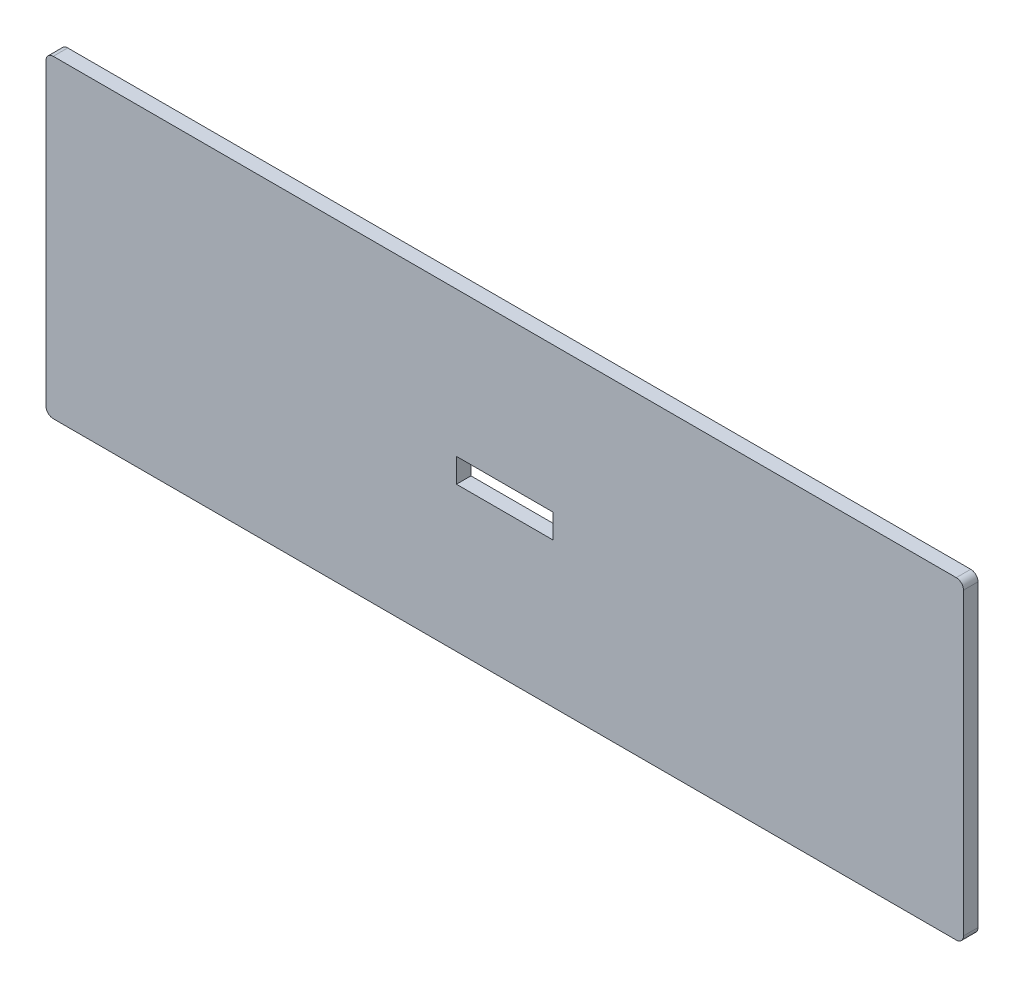
ISO-10303-21;
HEADER;
FILE_DESCRIPTION(('STEP AP214'),'2;1');
FILE_NAME('part.step','',(''),(''),'','','');
FILE_SCHEMA(('AUTOMOTIVE_DESIGN { 1 0 10303 214 1 1 1 1 }'));
ENDSEC;
DATA;
#1=APPLICATION_CONTEXT('core data for automotive mechanical design processes');
#2=APPLICATION_PROTOCOL_DEFINITION('international standard','automotive_design',2000,#1);
#3=PRODUCT_CONTEXT('',#1,'mechanical');
#4=PRODUCT('Part','Part','',(#3));
#5=PRODUCT_RELATED_PRODUCT_CATEGORY('part','',(#4));
#6=PRODUCT_DEFINITION_FORMATION('','',#4);
#7=PRODUCT_DEFINITION_CONTEXT('part definition',#1,'design');
#8=PRODUCT_DEFINITION('design','',#6,#7);
#9=PRODUCT_DEFINITION_SHAPE('','',#8);
#10=(LENGTH_UNIT() NAMED_UNIT(*) SI_UNIT(.MILLI.,.METRE.));
#11=(NAMED_UNIT(*) PLANE_ANGLE_UNIT() SI_UNIT($,.RADIAN.));
#12=(NAMED_UNIT(*) SI_UNIT($,.STERADIAN.) SOLID_ANGLE_UNIT());
#13=UNCERTAINTY_MEASURE_WITH_UNIT(LENGTH_MEASURE(1.E-05),#10,'distance_accuracy_value','');
#14=(GEOMETRIC_REPRESENTATION_CONTEXT(3) GLOBAL_UNCERTAINTY_ASSIGNED_CONTEXT((#13)) GLOBAL_UNIT_ASSIGNED_CONTEXT((#10,
#11,#12)) REPRESENTATION_CONTEXT('',''));
#15=CARTESIAN_POINT('',(0.,0.,0.));
#16=DIRECTION('',(0.,0.,1.));
#17=DIRECTION('',(1.,0.,0.));
#18=AXIS2_PLACEMENT_3D('',#15,#16,#17);
#19=CARTESIAN_POINT('',(0.,0.,3.));
#20=DIRECTION('',(0.,0.,-1.));
#21=DIRECTION('',(-1.,0.,0.));
#22=AXIS2_PLACEMENT_3D('',#19,#20,#21);
#23=PLANE('',#22);
#24=DIRECTION('',(0.,-1.,0.));
#25=VECTOR('',#24,1.);
#26=CARTESIAN_POINT('',(0.,0.,3.));
#27=LINE('',#26,#25);
#28=CARTESIAN_POINT('',(0.,63.5,3.));
#29=VERTEX_POINT('',#28);
#30=CARTESIAN_POINT('',(0.,1.5,3.));
#31=VERTEX_POINT('',#30);
#32=EDGE_CURVE('E171',#29,#31,#27,.T.);
#33=ORIENTED_EDGE('',*,*,#32,.T.);
#34=CARTESIAN_POINT('',(1.5,1.5,3.));
#35=DIRECTION('',(0.,0.,-1.));
#36=DIRECTION('',(-1.,0.,0.));
#37=AXIS2_PLACEMENT_3D('',#34,#35,#36);
#38=CIRCLE('',#37,1.5);
#39=CARTESIAN_POINT('',(1.5,0.,3.));
#40=VERTEX_POINT('',#39);
#41=EDGE_CURVE('E214',#31,#40,#38,.F.);
#42=ORIENTED_EDGE('',*,*,#41,.T.);
#43=DIRECTION('',(1.,0.,0.));
#44=VECTOR('',#43,1.);
#45=CARTESIAN_POINT('',(0.,0.,3.));
#46=LINE('',#45,#44);
#47=CARTESIAN_POINT('',(188.5,0.,3.));
#48=VERTEX_POINT('',#47);
#49=EDGE_CURVE('E174',#40,#48,#46,.T.);
#50=ORIENTED_EDGE('',*,*,#49,.T.);
#51=CARTESIAN_POINT('',(188.5,1.50000000000002,3.));
#52=DIRECTION('',(0.,0.,-1.));
#53=DIRECTION('',(-1.,0.,0.));
#54=AXIS2_PLACEMENT_3D('',#51,#52,#53);
#55=CIRCLE('',#54,1.5);
#56=CARTESIAN_POINT('',(190.,1.50000000000002,3.));
#57=VERTEX_POINT('',#56);
#58=EDGE_CURVE('E212',#48,#57,#55,.F.);
#59=ORIENTED_EDGE('',*,*,#58,.T.);
#60=DIRECTION('',(0.,1.,0.));
#61=VECTOR('',#60,1.);
#62=CARTESIAN_POINT('',(190.,0.,3.));
#63=LINE('',#62,#61);
#64=CARTESIAN_POINT('',(190.,63.5,3.));
#65=VERTEX_POINT('',#64);
#66=EDGE_CURVE('E178',#57,#65,#63,.T.);
#67=ORIENTED_EDGE('',*,*,#66,.T.);
#68=CARTESIAN_POINT('',(188.5,63.5,3.));
#69=DIRECTION('',(0.,0.,-1.));
#70=DIRECTION('',(-1.,0.,0.));
#71=AXIS2_PLACEMENT_3D('',#68,#69,#70);
#72=CIRCLE('',#71,1.5);
#73=CARTESIAN_POINT('',(188.5,65.,3.));
#74=VERTEX_POINT('',#73);
#75=EDGE_CURVE('E60',#65,#74,#72,.F.);
#76=ORIENTED_EDGE('',*,*,#75,.T.);
#77=DIRECTION('',(-1.,0.,0.));
#78=VECTOR('',#77,1.);
#79=CARTESIAN_POINT('',(0.,65.,3.));
#80=LINE('',#79,#78);
#81=CARTESIAN_POINT('',(1.5,65.,3.));
#82=VERTEX_POINT('',#81);
#83=EDGE_CURVE('E180',#74,#82,#80,.T.);
#84=ORIENTED_EDGE('',*,*,#83,.T.);
#85=CARTESIAN_POINT('',(1.5,63.5,3.));
#86=DIRECTION('',(0.,0.,-1.));
#87=DIRECTION('',(-1.,0.,0.));
#88=AXIS2_PLACEMENT_3D('',#85,#86,#87);
#89=CIRCLE('',#88,1.5);
#90=EDGE_CURVE('E209',#82,#29,#89,.F.);
#91=ORIENTED_EDGE('',*,*,#90,.T.);
#92=EDGE_LOOP('',(#33,#42,#50,#59,#67,#76,#84,#91));
#93=FACE_BOUND('',#92,.T.);
#94=DIRECTION('',(0.,-1.,0.));
#95=VECTOR('',#94,1.);
#96=CARTESIAN_POINT('',(85.,35.,3.));
#97=LINE('',#96,#95);
#98=CARTESIAN_POINT('',(85.,35.,3.));
#99=VERTEX_POINT('',#98);
#100=CARTESIAN_POINT('',(85.,30.,3.));
#101=VERTEX_POINT('',#100);
#102=EDGE_CURVE('E130',#99,#101,#97,.T.);
#103=ORIENTED_EDGE('',*,*,#102,.F.);
#104=DIRECTION('',(-1.,0.,0.));
#105=VECTOR('',#104,1.);
#106=CARTESIAN_POINT('',(85.,35.,3.));
#107=LINE('',#106,#105);
#108=CARTESIAN_POINT('',(105.,35.,3.));
#109=VERTEX_POINT('',#108);
#110=EDGE_CURVE('E155',#109,#99,#107,.T.);
#111=ORIENTED_EDGE('',*,*,#110,.F.);
#112=DIRECTION('',(0.,1.,0.));
#113=VECTOR('',#112,1.);
#114=CARTESIAN_POINT('',(105.,35.,3.));
#115=LINE('',#114,#113);
#116=CARTESIAN_POINT('',(105.,30.,3.));
#117=VERTEX_POINT('',#116);
#118=EDGE_CURVE('E153',#117,#109,#115,.T.);
#119=ORIENTED_EDGE('',*,*,#118,.F.);
#120=DIRECTION('',(1.,0.,0.));
#121=VECTOR('',#120,1.);
#122=CARTESIAN_POINT('',(85.,30.,3.));
#123=LINE('',#122,#121);
#124=EDGE_CURVE('E140',#101,#117,#123,.T.);
#125=ORIENTED_EDGE('',*,*,#124,.F.);
#126=EDGE_LOOP('',(#103,#111,#119,#125));
#127=FACE_BOUND('',#126,.T.);
#128=ADVANCED_FACE('F39',(#93,#127),#23,.F.);
#129=CARTESIAN_POINT('',(0.,0.,0.));
#130=DIRECTION('',(0.,0.,-1.));
#131=DIRECTION('',(-1.,0.,0.));
#132=AXIS2_PLACEMENT_3D('',#129,#130,#131);
#133=PLANE('',#132);
#134=DIRECTION('',(1.,0.,0.));
#135=VECTOR('',#134,1.);
#136=CARTESIAN_POINT('',(0.,0.,0.));
#137=LINE('',#136,#135);
#138=CARTESIAN_POINT('',(1.5,0.,0.));
#139=VERTEX_POINT('',#138);
#140=CARTESIAN_POINT('',(188.5,0.,0.));
#141=VERTEX_POINT('',#140);
#142=EDGE_CURVE('E185',#139,#141,#137,.T.);
#143=ORIENTED_EDGE('',*,*,#142,.F.);
#144=CARTESIAN_POINT('',(1.5,1.5,0.));
#145=DIRECTION('',(0.,0.,-1.));
#146=DIRECTION('',(-1.,0.,0.));
#147=AXIS2_PLACEMENT_3D('',#144,#145,#146);
#148=CIRCLE('',#147,1.5);
#149=CARTESIAN_POINT('',(0.,1.5,0.));
#150=VERTEX_POINT('',#149);
#151=EDGE_CURVE('E202',#139,#150,#148,.T.);
#152=ORIENTED_EDGE('',*,*,#151,.T.);
#153=DIRECTION('',(0.,-1.,0.));
#154=VECTOR('',#153,1.);
#155=CARTESIAN_POINT('',(0.,0.,0.));
#156=LINE('',#155,#154);
#157=CARTESIAN_POINT('',(0.,63.5,0.));
#158=VERTEX_POINT('',#157);
#159=EDGE_CURVE('E148',#158,#150,#156,.T.);
#160=ORIENTED_EDGE('',*,*,#159,.F.);
#161=CARTESIAN_POINT('',(1.5,63.5,0.));
#162=DIRECTION('',(0.,0.,-1.));
#163=DIRECTION('',(-1.,0.,0.));
#164=AXIS2_PLACEMENT_3D('',#161,#162,#163);
#165=CIRCLE('',#164,1.5);
#166=CARTESIAN_POINT('',(1.5,65.,0.));
#167=VERTEX_POINT('',#166);
#168=EDGE_CURVE('E196',#158,#167,#165,.T.);
#169=ORIENTED_EDGE('',*,*,#168,.T.);
#170=DIRECTION('',(-1.,0.,0.));
#171=VECTOR('',#170,1.);
#172=CARTESIAN_POINT('',(0.,65.,0.));
#173=LINE('',#172,#171);
#174=CARTESIAN_POINT('',(188.5,65.,0.));
#175=VERTEX_POINT('',#174);
#176=EDGE_CURVE('E175',#175,#167,#173,.T.);
#177=ORIENTED_EDGE('',*,*,#176,.F.);
#178=CARTESIAN_POINT('',(188.5,63.5,0.));
#179=DIRECTION('',(0.,0.,-1.));
#180=DIRECTION('',(-1.,0.,0.));
#181=AXIS2_PLACEMENT_3D('',#178,#179,#180);
#182=CIRCLE('',#181,1.5);
#183=CARTESIAN_POINT('',(190.,63.5,0.));
#184=VERTEX_POINT('',#183);
#185=EDGE_CURVE('E198',#175,#184,#182,.T.);
#186=ORIENTED_EDGE('',*,*,#185,.T.);
#187=DIRECTION('',(0.,1.,0.));
#188=VECTOR('',#187,1.);
#189=CARTESIAN_POINT('',(190.,0.,0.));
#190=LINE('',#189,#188);
#191=CARTESIAN_POINT('',(190.,1.50000000000002,0.));
#192=VERTEX_POINT('',#191);
#193=EDGE_CURVE('E188',#192,#184,#190,.T.);
#194=ORIENTED_EDGE('',*,*,#193,.F.);
#195=CARTESIAN_POINT('',(188.5,1.50000000000002,0.));
#196=DIRECTION('',(0.,0.,-1.));
#197=DIRECTION('',(-1.,0.,0.));
#198=AXIS2_PLACEMENT_3D('',#195,#196,#197);
#199=CIRCLE('',#198,1.5);
#200=EDGE_CURVE('E200',#192,#141,#199,.T.);
#201=ORIENTED_EDGE('',*,*,#200,.T.);
#202=EDGE_LOOP('',(#143,#152,#160,#169,#177,#186,#194,#201));
#203=FACE_BOUND('',#202,.T.);
#204=DIRECTION('',(-1.,0.,0.));
#205=VECTOR('',#204,1.);
#206=CARTESIAN_POINT('',(85.,35.,0.));
#207=LINE('',#206,#205);
#208=CARTESIAN_POINT('',(105.,35.,0.));
#209=VERTEX_POINT('',#208);
#210=CARTESIAN_POINT('',(85.,35.,0.));
#211=VERTEX_POINT('',#210);
#212=EDGE_CURVE('E141',#209,#211,#207,.T.);
#213=ORIENTED_EDGE('',*,*,#212,.T.);
#214=DIRECTION('',(0.,-1.,0.));
#215=VECTOR('',#214,1.);
#216=CARTESIAN_POINT('',(85.,35.,0.));
#217=LINE('',#216,#215);
#218=CARTESIAN_POINT('',(85.,30.,0.));
#219=VERTEX_POINT('',#218);
#220=EDGE_CURVE('E159',#211,#219,#217,.T.);
#221=ORIENTED_EDGE('',*,*,#220,.T.);
#222=DIRECTION('',(1.,0.,0.));
#223=VECTOR('',#222,1.);
#224=CARTESIAN_POINT('',(85.,30.,0.));
#225=LINE('',#224,#223);
#226=CARTESIAN_POINT('',(105.,30.,0.));
#227=VERTEX_POINT('',#226);
#228=EDGE_CURVE('E147',#219,#227,#225,.T.);
#229=ORIENTED_EDGE('',*,*,#228,.T.);
#230=DIRECTION('',(0.,1.,0.));
#231=VECTOR('',#230,1.);
#232=CARTESIAN_POINT('',(105.,35.,0.));
#233=LINE('',#232,#231);
#234=EDGE_CURVE('E162',#227,#209,#233,.T.);
#235=ORIENTED_EDGE('',*,*,#234,.T.);
#236=EDGE_LOOP('',(#213,#221,#229,#235));
#237=FACE_BOUND('',#236,.T.);
#238=ADVANCED_FACE('F230',(#203,#237),#133,.T.);
#239=CARTESIAN_POINT('',(0.,0.,3.));
#240=DIRECTION('',(1.,0.,0.));
#241=DIRECTION('',(0.,0.,-1.));
#242=AXIS2_PLACEMENT_3D('',#239,#240,#241);
#243=PLANE('',#242);
#244=ORIENTED_EDGE('',*,*,#159,.T.);
#245=DIRECTION('',(0.,0.,-1.));
#246=VECTOR('',#245,1.);
#247=CARTESIAN_POINT('',(0.,1.5,3.));
#248=LINE('',#247,#246);
#249=EDGE_CURVE('E207',#150,#31,#248,.F.);
#250=ORIENTED_EDGE('',*,*,#249,.T.);
#251=ORIENTED_EDGE('',*,*,#32,.F.);
#252=DIRECTION('',(0.,0.,-1.));
#253=VECTOR('',#252,1.);
#254=CARTESIAN_POINT('',(0.,63.5,3.));
#255=LINE('',#254,#253);
#256=EDGE_CURVE('E204',#29,#158,#255,.T.);
#257=ORIENTED_EDGE('',*,*,#256,.T.);
#258=EDGE_LOOP('',(#244,#250,#251,#257));
#259=FACE_BOUND('',#258,.T.);
#260=ADVANCED_FACE('F243',(#259),#243,.F.);
#261=CARTESIAN_POINT('',(0.,0.,3.));
#262=DIRECTION('',(0.,1.,0.));
#263=DIRECTION('',(-1.,0.,0.));
#264=AXIS2_PLACEMENT_3D('',#261,#262,#263);
#265=PLANE('',#264);
#266=ORIENTED_EDGE('',*,*,#49,.F.);
#267=DIRECTION('',(0.,0.,-1.));
#268=VECTOR('',#267,1.);
#269=CARTESIAN_POINT('',(1.5,0.,3.));
#270=LINE('',#269,#268);
#271=EDGE_CURVE('E193',#40,#139,#270,.T.);
#272=ORIENTED_EDGE('',*,*,#271,.T.);
#273=ORIENTED_EDGE('',*,*,#142,.T.);
#274=DIRECTION('',(0.,0.,-1.));
#275=VECTOR('',#274,1.);
#276=CARTESIAN_POINT('',(188.5,0.,3.));
#277=LINE('',#276,#275);
#278=EDGE_CURVE('E182',#141,#48,#277,.F.);
#279=ORIENTED_EDGE('',*,*,#278,.T.);
#280=EDGE_LOOP('',(#266,#272,#273,#279));
#281=FACE_BOUND('',#280,.T.);
#282=ADVANCED_FACE('F251',(#281),#265,.F.);
#283=CARTESIAN_POINT('',(190.,0.,3.));
#284=DIRECTION('',(-1.,0.,0.));
#285=DIRECTION('',(0.,0.,1.));
#286=AXIS2_PLACEMENT_3D('',#283,#284,#285);
#287=PLANE('',#286);
#288=ORIENTED_EDGE('',*,*,#66,.F.);
#289=DIRECTION('',(0.,0.,-1.));
#290=VECTOR('',#289,1.);
#291=CARTESIAN_POINT('',(190.,1.50000000000002,3.));
#292=LINE('',#291,#290);
#293=EDGE_CURVE('E218',#57,#192,#292,.T.);
#294=ORIENTED_EDGE('',*,*,#293,.T.);
#295=ORIENTED_EDGE('',*,*,#193,.T.);
#296=DIRECTION('',(0.,0.,-1.));
#297=VECTOR('',#296,1.);
#298=CARTESIAN_POINT('',(190.,63.5,3.));
#299=LINE('',#298,#297);
#300=EDGE_CURVE('E216',#184,#65,#299,.F.);
#301=ORIENTED_EDGE('',*,*,#300,.T.);
#302=EDGE_LOOP('',(#288,#294,#295,#301));
#303=FACE_BOUND('',#302,.T.);
#304=ADVANCED_FACE('F224',(#303),#287,.F.);
#305=CARTESIAN_POINT('',(0.,65.,3.));
#306=DIRECTION('',(0.,-1.,0.));
#307=DIRECTION('',(1.,0.,0.));
#308=AXIS2_PLACEMENT_3D('',#305,#306,#307);
#309=PLANE('',#308);
#310=ORIENTED_EDGE('',*,*,#83,.F.);
#311=DIRECTION('',(0.,0.,-1.));
#312=VECTOR('',#311,1.);
#313=CARTESIAN_POINT('',(188.5,65.,3.));
#314=LINE('',#313,#312);
#315=EDGE_CURVE('E11',#74,#175,#314,.T.);
#316=ORIENTED_EDGE('',*,*,#315,.T.);
#317=ORIENTED_EDGE('',*,*,#176,.T.);
#318=DIRECTION('',(0.,0.,-1.));
#319=VECTOR('',#318,1.);
#320=CARTESIAN_POINT('',(1.5,65.,3.));
#321=LINE('',#320,#319);
#322=EDGE_CURVE('E47',#167,#82,#321,.F.);
#323=ORIENTED_EDGE('',*,*,#322,.T.);
#324=EDGE_LOOP('',(#310,#316,#317,#323));
#325=FACE_BOUND('',#324,.T.);
#326=ADVANCED_FACE('F236',(#325),#309,.F.);
#327=CARTESIAN_POINT('',(85.,35.,3.));
#328=DIRECTION('',(1.,0.,0.));
#329=DIRECTION('',(0.,0.,-1.));
#330=AXIS2_PLACEMENT_3D('',#327,#328,#329);
#331=PLANE('',#330);
#332=ORIENTED_EDGE('',*,*,#220,.F.);
#333=DIRECTION('',(0.,0.,-1.));
#334=VECTOR('',#333,1.);
#335=CARTESIAN_POINT('',(85.,35.,3.));
#336=LINE('',#335,#334);
#337=EDGE_CURVE('E136',#99,#211,#336,.T.);
#338=ORIENTED_EDGE('',*,*,#337,.F.);
#339=ORIENTED_EDGE('',*,*,#102,.T.);
#340=DIRECTION('',(0.,0.,-1.));
#341=VECTOR('',#340,1.);
#342=CARTESIAN_POINT('',(85.,30.,3.));
#343=LINE('',#342,#341);
#344=EDGE_CURVE('E133',#101,#219,#343,.T.);
#345=ORIENTED_EDGE('',*,*,#344,.T.);
#346=EDGE_LOOP('',(#332,#338,#339,#345));
#347=FACE_BOUND('',#346,.T.);
#348=ADVANCED_FACE('F132',(#347),#331,.T.);
#349=CARTESIAN_POINT('',(85.,30.,3.));
#350=DIRECTION('',(0.,1.,0.));
#351=DIRECTION('',(0.,0.,1.));
#352=AXIS2_PLACEMENT_3D('',#349,#350,#351);
#353=PLANE('',#352);
#354=ORIENTED_EDGE('',*,*,#228,.F.);
#355=ORIENTED_EDGE('',*,*,#344,.F.);
#356=ORIENTED_EDGE('',*,*,#124,.T.);
#357=DIRECTION('',(0.,0.,-1.));
#358=VECTOR('',#357,1.);
#359=CARTESIAN_POINT('',(105.,30.,3.));
#360=LINE('',#359,#358);
#361=EDGE_CURVE('E149',#117,#227,#360,.T.);
#362=ORIENTED_EDGE('',*,*,#361,.T.);
#363=EDGE_LOOP('',(#354,#355,#356,#362));
#364=FACE_BOUND('',#363,.T.);
#365=ADVANCED_FACE('F144',(#364),#353,.T.);
#366=CARTESIAN_POINT('',(105.,35.,3.));
#367=DIRECTION('',(-1.,0.,0.));
#368=DIRECTION('',(0.,-1.,0.));
#369=AXIS2_PLACEMENT_3D('',#366,#367,#368);
#370=PLANE('',#369);
#371=ORIENTED_EDGE('',*,*,#234,.F.);
#372=ORIENTED_EDGE('',*,*,#361,.F.);
#373=ORIENTED_EDGE('',*,*,#118,.T.);
#374=DIRECTION('',(0.,0.,-1.));
#375=VECTOR('',#374,1.);
#376=CARTESIAN_POINT('',(105.,35.,3.));
#377=LINE('',#376,#375);
#378=EDGE_CURVE('E168',#109,#209,#377,.T.);
#379=ORIENTED_EDGE('',*,*,#378,.T.);
#380=EDGE_LOOP('',(#371,#372,#373,#379));
#381=FACE_BOUND('',#380,.T.);
#382=ADVANCED_FACE('F330',(#381),#370,.T.);
#383=CARTESIAN_POINT('',(85.,35.,3.));
#384=DIRECTION('',(0.,-1.,0.));
#385=DIRECTION('',(1.,0.,0.));
#386=AXIS2_PLACEMENT_3D('',#383,#384,#385);
#387=PLANE('',#386);
#388=ORIENTED_EDGE('',*,*,#212,.F.);
#389=ORIENTED_EDGE('',*,*,#378,.F.);
#390=ORIENTED_EDGE('',*,*,#110,.T.);
#391=ORIENTED_EDGE('',*,*,#337,.T.);
#392=EDGE_LOOP('',(#388,#389,#390,#391));
#393=FACE_BOUND('',#392,.T.);
#394=ADVANCED_FACE('F260',(#393),#387,.T.);
#395=CARTESIAN_POINT('',(1.5,1.5,3.));
#396=DIRECTION('',(0.,0.,-1.));
#397=DIRECTION('',(-1.,0.,0.));
#398=AXIS2_PLACEMENT_3D('',#395,#396,#397);
#399=CYLINDRICAL_SURFACE('',#398,1.5);
#400=ORIENTED_EDGE('',*,*,#41,.F.);
#401=ORIENTED_EDGE('',*,*,#249,.F.);
#402=ORIENTED_EDGE('',*,*,#151,.F.);
#403=ORIENTED_EDGE('',*,*,#271,.F.);
#404=EDGE_LOOP('',(#400,#401,#402,#403));
#405=FACE_BOUND('',#404,.T.);
#406=ADVANCED_FACE('F248',(#405),#399,.T.);
#407=CARTESIAN_POINT('',(188.5,1.50000000000002,3.));
#408=DIRECTION('',(0.,0.,-1.));
#409=DIRECTION('',(-1.,0.,0.));
#410=AXIS2_PLACEMENT_3D('',#407,#408,#409);
#411=CYLINDRICAL_SURFACE('',#410,1.5);
#412=ORIENTED_EDGE('',*,*,#58,.F.);
#413=ORIENTED_EDGE('',*,*,#278,.F.);
#414=ORIENTED_EDGE('',*,*,#200,.F.);
#415=ORIENTED_EDGE('',*,*,#293,.F.);
#416=EDGE_LOOP('',(#412,#413,#414,#415));
#417=FACE_BOUND('',#416,.T.);
#418=ADVANCED_FACE('F253',(#417),#411,.T.);
#419=CARTESIAN_POINT('',(188.5,63.5,3.));
#420=DIRECTION('',(0.,0.,-1.));
#421=DIRECTION('',(-1.,0.,0.));
#422=AXIS2_PLACEMENT_3D('',#419,#420,#421);
#423=CYLINDRICAL_SURFACE('',#422,1.5);
#424=ORIENTED_EDGE('',*,*,#75,.F.);
#425=ORIENTED_EDGE('',*,*,#300,.F.);
#426=ORIENTED_EDGE('',*,*,#185,.F.);
#427=ORIENTED_EDGE('',*,*,#315,.F.);
#428=EDGE_LOOP('',(#424,#425,#426,#427));
#429=FACE_BOUND('',#428,.T.);
#430=ADVANCED_FACE('F235',(#429),#423,.T.);
#431=CARTESIAN_POINT('',(1.5,63.5,3.));
#432=DIRECTION('',(0.,0.,-1.));
#433=DIRECTION('',(-1.,0.,0.));
#434=AXIS2_PLACEMENT_3D('',#431,#432,#433);
#435=CYLINDRICAL_SURFACE('',#434,1.5);
#436=ORIENTED_EDGE('',*,*,#90,.F.);
#437=ORIENTED_EDGE('',*,*,#322,.F.);
#438=ORIENTED_EDGE('',*,*,#168,.F.);
#439=ORIENTED_EDGE('',*,*,#256,.F.);
#440=EDGE_LOOP('',(#436,#437,#438,#439));
#441=FACE_BOUND('',#440,.T.);
#442=ADVANCED_FACE('F41',(#441),#435,.T.);
#443=CLOSED_SHELL('',(#128,#238,#260,#282,#304,#326,#348,#365,#382,#394,#406,#418,#430,#442));
#444=MANIFOLD_SOLID_BREP('B2',#443);
#445=ADVANCED_BREP_SHAPE_REPRESENTATION('',(#18,#444),#14);
#446=SHAPE_DEFINITION_REPRESENTATION(#9,#445);
ENDSEC;
END-ISO-10303-21;
